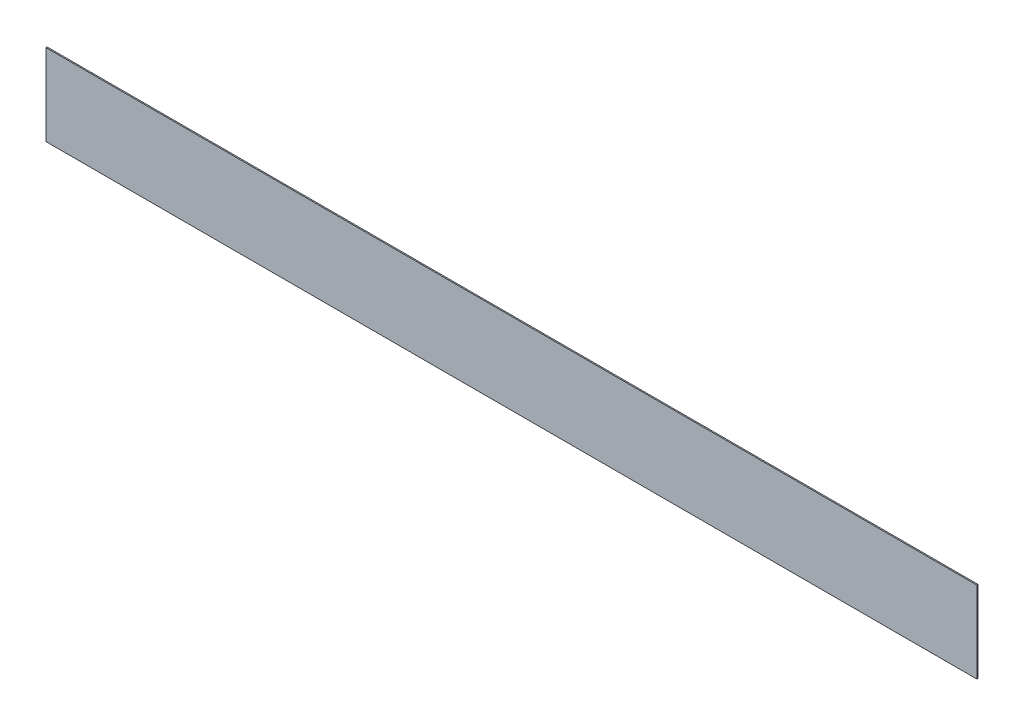
ISO-10303-21;
HEADER;
FILE_DESCRIPTION(('STEP AP214'),'2;1');
FILE_NAME('part.step','',(''),(''),'','','');
FILE_SCHEMA(('AUTOMOTIVE_DESIGN { 1 0 10303 214 1 1 1 1 }'));
ENDSEC;
DATA;
#1=APPLICATION_CONTEXT('core data for automotive mechanical design processes');
#2=APPLICATION_PROTOCOL_DEFINITION('international standard','automotive_design',2000,#1);
#3=PRODUCT_CONTEXT('',#1,'mechanical');
#4=PRODUCT('Part','Part','',(#3));
#5=PRODUCT_RELATED_PRODUCT_CATEGORY('part','',(#4));
#6=PRODUCT_DEFINITION_FORMATION('','',#4);
#7=PRODUCT_DEFINITION_CONTEXT('part definition',#1,'design');
#8=PRODUCT_DEFINITION('design','',#6,#7);
#9=PRODUCT_DEFINITION_SHAPE('','',#8);
#10=(LENGTH_UNIT() NAMED_UNIT(*) SI_UNIT(.MILLI.,.METRE.));
#11=(NAMED_UNIT(*) PLANE_ANGLE_UNIT() SI_UNIT($,.RADIAN.));
#12=(NAMED_UNIT(*) SI_UNIT($,.STERADIAN.) SOLID_ANGLE_UNIT());
#13=UNCERTAINTY_MEASURE_WITH_UNIT(LENGTH_MEASURE(1.E-05),#10,'distance_accuracy_value','');
#14=(GEOMETRIC_REPRESENTATION_CONTEXT(3) GLOBAL_UNCERTAINTY_ASSIGNED_CONTEXT((#13)) GLOBAL_UNIT_ASSIGNED_CONTEXT((#10,
#11,#12)) REPRESENTATION_CONTEXT('',''));
#15=CARTESIAN_POINT('',(0.,0.,0.));
#16=DIRECTION('',(0.,0.,1.));
#17=DIRECTION('',(1.,0.,0.));
#18=AXIS2_PLACEMENT_3D('',#15,#16,#17);
#19=CARTESIAN_POINT('',(4000.,-349.999999999999,10.));
#20=DIRECTION('',(-1.,0.,0.));
#21=DIRECTION('',(0.,0.,1.));
#22=AXIS2_PLACEMENT_3D('',#19,#20,#21);
#23=PLANE('',#22);
#24=DIRECTION('',(0.,1.,0.));
#25=VECTOR('',#24,1.);
#26=CARTESIAN_POINT('',(4000.,-349.999999999999,0.));
#27=LINE('',#26,#25);
#28=CARTESIAN_POINT('',(4000.,-349.999999999999,0.));
#29=VERTEX_POINT('',#28);
#30=CARTESIAN_POINT('',(4000.,350.,0.));
#31=VERTEX_POINT('',#30);
#32=EDGE_CURVE('E104',#29,#31,#27,.T.);
#33=ORIENTED_EDGE('',*,*,#32,.T.);
#34=DIRECTION('',(0.,0.,-1.));
#35=VECTOR('',#34,1.);
#36=CARTESIAN_POINT('',(4000.,350.,10.));
#37=LINE('',#36,#35);
#38=CARTESIAN_POINT('',(4000.,350.,10.));
#39=VERTEX_POINT('',#38);
#40=EDGE_CURVE('E11',#39,#31,#37,.T.);
#41=ORIENTED_EDGE('',*,*,#40,.F.);
#42=DIRECTION('',(0.,1.,0.));
#43=VECTOR('',#42,1.);
#44=CARTESIAN_POINT('',(4000.,-349.999999999999,10.));
#45=LINE('',#44,#43);
#46=CARTESIAN_POINT('',(4000.,-349.999999999999,10.));
#47=VERTEX_POINT('',#46);
#48=EDGE_CURVE('E92',#47,#39,#45,.T.);
#49=ORIENTED_EDGE('',*,*,#48,.F.);
#50=DIRECTION('',(0.,0.,-1.));
#51=VECTOR('',#50,1.);
#52=CARTESIAN_POINT('',(4000.,-349.999999999999,10.));
#53=LINE('',#52,#51);
#54=EDGE_CURVE('E100',#47,#29,#53,.T.);
#55=ORIENTED_EDGE('',*,*,#54,.T.);
#56=EDGE_LOOP('',(#33,#41,#49,#55));
#57=FACE_BOUND('',#56,.T.);
#58=ADVANCED_FACE('F41',(#57),#23,.F.);
#59=CARTESIAN_POINT('',(-4000.,350.,10.));
#60=DIRECTION('',(0.,-1.,0.));
#61=DIRECTION('',(0.,0.,-1.));
#62=AXIS2_PLACEMENT_3D('',#59,#60,#61);
#63=PLANE('',#62);
#64=DIRECTION('',(-1.,0.,0.));
#65=VECTOR('',#64,1.);
#66=CARTESIAN_POINT('',(-4000.,350.,0.));
#67=LINE('',#66,#65);
#68=CARTESIAN_POINT('',(-4000.,350.,0.));
#69=VERTEX_POINT('',#68);
#70=EDGE_CURVE('E96',#31,#69,#67,.T.);
#71=ORIENTED_EDGE('',*,*,#70,.T.);
#72=DIRECTION('',(0.,0.,-1.));
#73=VECTOR('',#72,1.);
#74=CARTESIAN_POINT('',(-4000.,350.,10.));
#75=LINE('',#74,#73);
#76=CARTESIAN_POINT('',(-4000.,350.,10.));
#77=VERTEX_POINT('',#76);
#78=EDGE_CURVE('E49',#77,#69,#75,.T.);
#79=ORIENTED_EDGE('',*,*,#78,.F.);
#80=DIRECTION('',(-1.,0.,0.));
#81=VECTOR('',#80,1.);
#82=CARTESIAN_POINT('',(-4000.,350.,10.));
#83=LINE('',#82,#81);
#84=EDGE_CURVE('E87',#39,#77,#83,.T.);
#85=ORIENTED_EDGE('',*,*,#84,.F.);
#86=ORIENTED_EDGE('',*,*,#40,.T.);
#87=EDGE_LOOP('',(#71,#79,#85,#86));
#88=FACE_BOUND('',#87,.T.);
#89=ADVANCED_FACE('F95',(#88),#63,.F.);
#90=CARTESIAN_POINT('',(-4000.,-349.999999999999,10.));
#91=DIRECTION('',(1.,0.,0.));
#92=DIRECTION('',(0.,0.,-1.));
#93=AXIS2_PLACEMENT_3D('',#90,#91,#92);
#94=PLANE('',#93);
#95=DIRECTION('',(0.,-1.,0.));
#96=VECTOR('',#95,1.);
#97=CARTESIAN_POINT('',(-4000.,-349.999999999999,0.));
#98=LINE('',#97,#96);
#99=CARTESIAN_POINT('',(-4000.,-349.999999999999,0.));
#100=VERTEX_POINT('',#99);
#101=EDGE_CURVE('E74',#69,#100,#98,.T.);
#102=ORIENTED_EDGE('',*,*,#101,.T.);
#103=DIRECTION('',(0.,0.,-1.));
#104=VECTOR('',#103,1.);
#105=CARTESIAN_POINT('',(-4000.,-349.999999999999,10.));
#106=LINE('',#105,#104);
#107=CARTESIAN_POINT('',(-4000.,-349.999999999999,10.));
#108=VERTEX_POINT('',#107);
#109=EDGE_CURVE('E97',#108,#100,#106,.T.);
#110=ORIENTED_EDGE('',*,*,#109,.F.);
#111=DIRECTION('',(0.,-1.,0.));
#112=VECTOR('',#111,1.);
#113=CARTESIAN_POINT('',(-4000.,-349.999999999999,10.));
#114=LINE('',#113,#112);
#115=EDGE_CURVE('E90',#77,#108,#114,.T.);
#116=ORIENTED_EDGE('',*,*,#115,.F.);
#117=ORIENTED_EDGE('',*,*,#78,.T.);
#118=EDGE_LOOP('',(#102,#110,#116,#117));
#119=FACE_BOUND('',#118,.T.);
#120=ADVANCED_FACE('F98',(#119),#94,.F.);
#121=CARTESIAN_POINT('',(-4000.,-349.999999999999,10.));
#122=DIRECTION('',(0.,1.,0.));
#123=DIRECTION('',(0.,0.,1.));
#124=AXIS2_PLACEMENT_3D('',#121,#122,#123);
#125=PLANE('',#124);
#126=DIRECTION('',(1.,0.,0.));
#127=VECTOR('',#126,1.);
#128=CARTESIAN_POINT('',(-4000.,-349.999999999999,0.));
#129=LINE('',#128,#127);
#130=EDGE_CURVE('E80',#100,#29,#129,.T.);
#131=ORIENTED_EDGE('',*,*,#130,.T.);
#132=ORIENTED_EDGE('',*,*,#54,.F.);
#133=DIRECTION('',(1.,0.,0.));
#134=VECTOR('',#133,1.);
#135=CARTESIAN_POINT('',(-4000.,-349.999999999999,10.));
#136=LINE('',#135,#134);
#137=EDGE_CURVE('E57',#108,#47,#136,.T.);
#138=ORIENTED_EDGE('',*,*,#137,.F.);
#139=ORIENTED_EDGE('',*,*,#109,.T.);
#140=EDGE_LOOP('',(#131,#132,#138,#139));
#141=FACE_BOUND('',#140,.T.);
#142=ADVANCED_FACE('F111',(#141),#125,.F.);
#143=CARTESIAN_POINT('',(0.,0.,10.));
#144=DIRECTION('',(0.,0.,-1.));
#145=DIRECTION('',(-1.,0.,0.));
#146=AXIS2_PLACEMENT_3D('',#143,#144,#145);
#147=PLANE('',#146);
#148=ORIENTED_EDGE('',*,*,#48,.T.);
#149=ORIENTED_EDGE('',*,*,#84,.T.);
#150=ORIENTED_EDGE('',*,*,#115,.T.);
#151=ORIENTED_EDGE('',*,*,#137,.T.);
#152=EDGE_LOOP('',(#148,#149,#150,#151));
#153=FACE_BOUND('',#152,.T.);
#154=ADVANCED_FACE('F88',(#153),#147,.F.);
#155=CARTESIAN_POINT('',(0.,0.,0.));
#156=DIRECTION('',(0.,0.,-1.));
#157=DIRECTION('',(-1.,0.,0.));
#158=AXIS2_PLACEMENT_3D('',#155,#156,#157);
#159=PLANE('',#158);
#160=ORIENTED_EDGE('',*,*,#32,.F.);
#161=ORIENTED_EDGE('',*,*,#130,.F.);
#162=ORIENTED_EDGE('',*,*,#101,.F.);
#163=ORIENTED_EDGE('',*,*,#70,.F.);
#164=EDGE_LOOP('',(#160,#161,#162,#163));
#165=FACE_BOUND('',#164,.T.);
#166=ADVANCED_FACE('F114',(#165),#159,.T.);
#167=CLOSED_SHELL('',(#58,#89,#120,#142,#154,#166));
#168=MANIFOLD_SOLID_BREP('B2',#167);
#169=ADVANCED_BREP_SHAPE_REPRESENTATION('',(#18,#168),#14);
#170=SHAPE_DEFINITION_REPRESENTATION(#9,#169);
ENDSEC;
END-ISO-10303-21;
